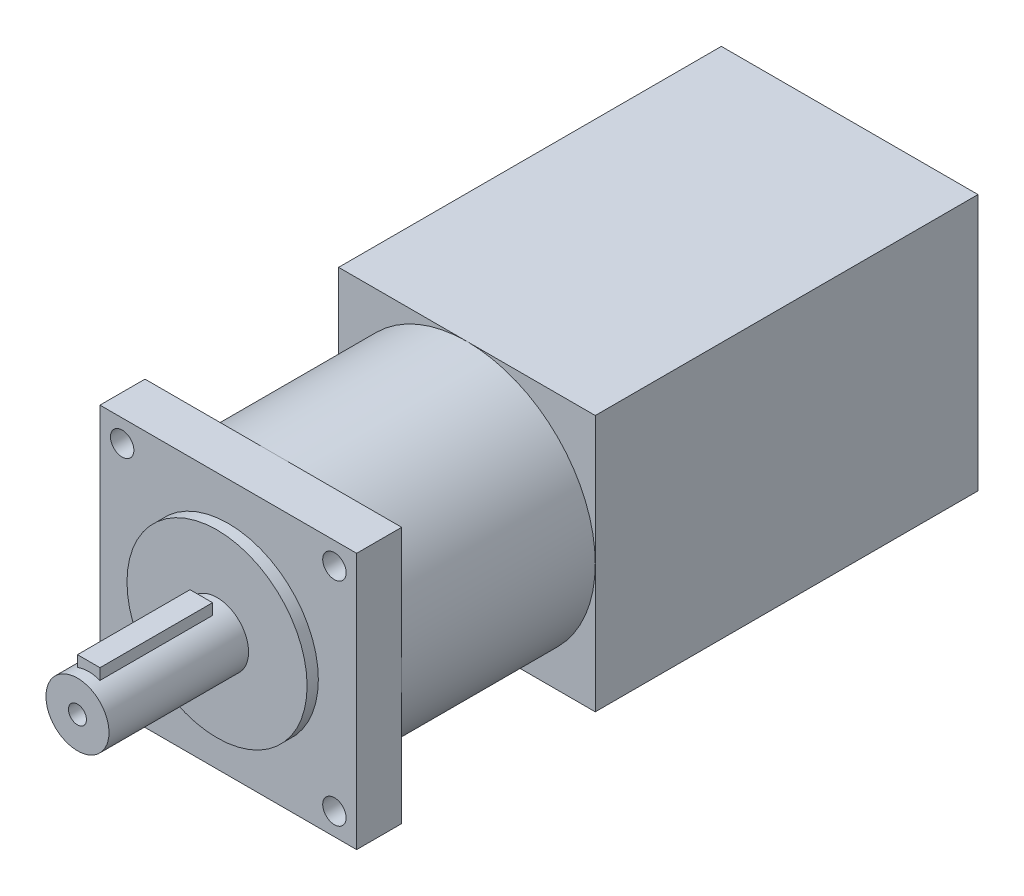
ISO-10303-21;
HEADER;
FILE_DESCRIPTION(('STEP AP214'),'2;1');
FILE_NAME('part.step','',(''),(''),'','','');
FILE_SCHEMA(('AUTOMOTIVE_DESIGN { 1 0 10303 214 1 1 1 1 }'));
ENDSEC;
DATA;
#1=APPLICATION_CONTEXT('core data for automotive mechanical design processes');
#2=APPLICATION_PROTOCOL_DEFINITION('international standard','automotive_design',2000,#1);
#3=PRODUCT_CONTEXT('',#1,'mechanical');
#4=PRODUCT('Part','Part','',(#3));
#5=PRODUCT_RELATED_PRODUCT_CATEGORY('part','',(#4));
#6=PRODUCT_DEFINITION_FORMATION('','',#4);
#7=PRODUCT_DEFINITION_CONTEXT('part definition',#1,'design');
#8=PRODUCT_DEFINITION('design','',#6,#7);
#9=PRODUCT_DEFINITION_SHAPE('','',#8);
#10=(LENGTH_UNIT() NAMED_UNIT(*) SI_UNIT(.MILLI.,.METRE.));
#11=(NAMED_UNIT(*) PLANE_ANGLE_UNIT() SI_UNIT($,.RADIAN.));
#12=(NAMED_UNIT(*) SI_UNIT($,.STERADIAN.) SOLID_ANGLE_UNIT());
#13=UNCERTAINTY_MEASURE_WITH_UNIT(LENGTH_MEASURE(1.E-05),#10,'distance_accuracy_value','');
#14=(GEOMETRIC_REPRESENTATION_CONTEXT(3) GLOBAL_UNCERTAINTY_ASSIGNED_CONTEXT((#13)) GLOBAL_UNIT_ASSIGNED_CONTEXT((#10,
#11,#12)) REPRESENTATION_CONTEXT('',''));
#15=CARTESIAN_POINT('',(0.,0.,0.));
#16=DIRECTION('',(0.,0.,1.));
#17=DIRECTION('',(1.,0.,0.));
#18=AXIS2_PLACEMENT_3D('',#15,#16,#17);
#19=CARTESIAN_POINT('',(0.,0.,171.5));
#20=DIRECTION('',(0.,0.,-1.));
#21=DIRECTION('',(-1.,0.,0.));
#22=AXIS2_PLACEMENT_3D('',#19,#20,#21);
#23=CYLINDRICAL_SURFACE('',#22,7.);
#24=CARTESIAN_POINT('',(0.,0.,140.5));
#25=DIRECTION('',(0.,0.,1.));
#26=DIRECTION('',(1.,0.,0.));
#27=AXIS2_PLACEMENT_3D('',#24,#25,#26);
#28=CIRCLE('',#27,7.);
#29=CARTESIAN_POINT('',(7.,0.,140.5));
#30=VERTEX_POINT('',#29);
#31=EDGE_CURVE('E247',#30,#30,#28,.T.);
#32=ORIENTED_EDGE('',*,*,#31,.T.);
#33=EDGE_LOOP('',(#32));
#34=FACE_BOUND('',#33,.T.);
#35=CARTESIAN_POINT('',(0.,0.,171.5));
#36=DIRECTION('',(0.,0.,1.));
#37=DIRECTION('',(1.,0.,0.));
#38=AXIS2_PLACEMENT_3D('',#35,#36,#37);
#39=CIRCLE('',#38,7.);
#40=CARTESIAN_POINT('',(7.,0.,171.5));
#41=VERTEX_POINT('',#40);
#42=EDGE_CURVE('E235',#41,#41,#39,.T.);
#43=ORIENTED_EDGE('',*,*,#42,.F.);
#44=EDGE_LOOP('',(#43));
#45=FACE_BOUND('',#44,.T.);
#46=CARTESIAN_POINT('',(0.,0.,144.));
#47=DIRECTION('',(0.,0.,1.));
#48=DIRECTION('',(1.,0.,0.));
#49=AXIS2_PLACEMENT_3D('',#46,#47,#48);
#50=CIRCLE('',#49,7.);
#51=CARTESIAN_POINT('',(2.5,6.53834841531101,144.));
#52=VERTEX_POINT('',#51);
#53=CARTESIAN_POINT('',(-2.5,6.53834841531101,144.));
#54=VERTEX_POINT('',#53);
#55=EDGE_CURVE('E11',#52,#54,#50,.T.);
#56=ORIENTED_EDGE('',*,*,#55,.F.);
#57=DIRECTION('',(0.,0.,-1.));
#58=VECTOR('',#57,1.);
#59=CARTESIAN_POINT('',(2.5,6.53834841531101,171.5));
#60=LINE('',#59,#58);
#61=CARTESIAN_POINT('',(2.5,6.53834841531101,169.));
#62=VERTEX_POINT('',#61);
#63=EDGE_CURVE('E157',#52,#62,#60,.F.);
#64=ORIENTED_EDGE('',*,*,#63,.T.);
#65=CARTESIAN_POINT('',(0.,0.,169.));
#66=DIRECTION('',(0.,0.,1.));
#67=DIRECTION('',(1.,0.,0.));
#68=AXIS2_PLACEMENT_3D('',#65,#66,#67);
#69=CIRCLE('',#68,7.);
#70=CARTESIAN_POINT('',(-2.5,6.53834841531101,169.));
#71=VERTEX_POINT('',#70);
#72=EDGE_CURVE('E301',#62,#71,#69,.T.);
#73=ORIENTED_EDGE('',*,*,#72,.T.);
#74=DIRECTION('',(0.,0.,-1.));
#75=VECTOR('',#74,1.);
#76=CARTESIAN_POINT('',(-2.5,6.53834841531101,171.5));
#77=LINE('',#76,#75);
#78=EDGE_CURVE('E44',#71,#54,#77,.T.);
#79=ORIENTED_EDGE('',*,*,#78,.T.);
#80=EDGE_LOOP('',(#56,#64,#73,#79));
#81=FACE_BOUND('',#80,.T.);
#82=ADVANCED_FACE('F36',(#34,#45,#81),#23,.T.);
#83=CARTESIAN_POINT('',(0.,0.,138.));
#84=DIRECTION('',(0.,0.,1.));
#85=DIRECTION('',(1.,0.,0.));
#86=AXIS2_PLACEMENT_3D('',#83,#84,#85);
#87=PLANE('',#86);
#88=CARTESIAN_POINT('',(0.,0.,138.));
#89=DIRECTION('',(0.,0.,1.));
#90=DIRECTION('',(1.,0.,0.));
#91=AXIS2_PLACEMENT_3D('',#88,#89,#90);
#92=CIRCLE('',#91,20.);
#93=CARTESIAN_POINT('',(20.,0.,138.));
#94=VERTEX_POINT('',#93);
#95=EDGE_CURVE('E251',#94,#94,#92,.T.);
#96=ORIENTED_EDGE('',*,*,#95,.F.);
#97=EDGE_LOOP('',(#96));
#98=FACE_BOUND('',#97,.T.);
#99=DIRECTION('',(1.,0.,0.));
#100=VECTOR('',#99,1.);
#101=CARTESIAN_POINT('',(-28.5,-28.5,138.));
#102=LINE('',#101,#100);
#103=CARTESIAN_POINT('',(-28.5,-28.5,138.));
#104=VERTEX_POINT('',#103);
#105=CARTESIAN_POINT('',(28.5,-28.5,138.));
#106=VERTEX_POINT('',#105);
#107=EDGE_CURVE('E229',#104,#106,#102,.T.);
#108=ORIENTED_EDGE('',*,*,#107,.T.);
#109=DIRECTION('',(0.,1.,0.));
#110=VECTOR('',#109,1.);
#111=CARTESIAN_POINT('',(28.5,-28.5,138.));
#112=LINE('',#111,#110);
#113=CARTESIAN_POINT('',(28.5,28.5,138.));
#114=VERTEX_POINT('',#113);
#115=EDGE_CURVE('E204',#106,#114,#112,.T.);
#116=ORIENTED_EDGE('',*,*,#115,.T.);
#117=DIRECTION('',(-1.,0.,0.));
#118=VECTOR('',#117,1.);
#119=CARTESIAN_POINT('',(-28.5,28.5,138.));
#120=LINE('',#119,#118);
#121=CARTESIAN_POINT('',(-28.5,28.5,138.));
#122=VERTEX_POINT('',#121);
#123=EDGE_CURVE('E224',#114,#122,#120,.T.);
#124=ORIENTED_EDGE('',*,*,#123,.T.);
#125=DIRECTION('',(0.,-1.,0.));
#126=VECTOR('',#125,1.);
#127=CARTESIAN_POINT('',(-28.5,-28.5,138.));
#128=LINE('',#127,#126);
#129=EDGE_CURVE('E226',#122,#104,#128,.T.);
#130=ORIENTED_EDGE('',*,*,#129,.T.);
#131=EDGE_LOOP('',(#108,#116,#124,#130));
#132=FACE_BOUND('',#131,.T.);
#133=CARTESIAN_POINT('',(-23.5699999999987,-23.57,138.));
#134=DIRECTION('',(0.,0.,1.));
#135=DIRECTION('',(1.,0.,0.));
#136=AXIS2_PLACEMENT_3D('',#133,#134,#135);
#137=CIRCLE('',#136,2.60000000000069);
#138=CARTESIAN_POINT('',(-20.969999999998,-23.57,138.));
#139=VERTEX_POINT('',#138);
#140=EDGE_CURVE('E181',#139,#139,#137,.T.);
#141=ORIENTED_EDGE('',*,*,#140,.F.);
#142=EDGE_LOOP('',(#141));
#143=FACE_BOUND('',#142,.T.);
#144=CARTESIAN_POINT('',(23.5700000000013,-23.5699999999987,138.));
#145=DIRECTION('',(0.,0.,1.));
#146=DIRECTION('',(1.,0.,0.));
#147=AXIS2_PLACEMENT_3D('',#144,#145,#146);
#148=CIRCLE('',#147,2.60000000000186);
#149=CARTESIAN_POINT('',(26.1700000000032,-23.5699999999987,138.));
#150=VERTEX_POINT('',#149);
#151=EDGE_CURVE('E186',#150,#150,#148,.T.);
#152=ORIENTED_EDGE('',*,*,#151,.F.);
#153=EDGE_LOOP('',(#152));
#154=FACE_BOUND('',#153,.T.);
#155=CARTESIAN_POINT('',(23.57,23.5700000000013,138.));
#156=DIRECTION('',(0.,0.,1.));
#157=DIRECTION('',(1.,0.,0.));
#158=AXIS2_PLACEMENT_3D('',#155,#156,#157);
#159=CIRCLE('',#158,2.60000000000137);
#160=CARTESIAN_POINT('',(26.1700000000014,23.5700000000013,138.));
#161=VERTEX_POINT('',#160);
#162=EDGE_CURVE('E192',#161,#161,#159,.T.);
#163=ORIENTED_EDGE('',*,*,#162,.F.);
#164=EDGE_LOOP('',(#163));
#165=FACE_BOUND('',#164,.T.);
#166=CARTESIAN_POINT('',(-23.57,23.57,138.));
#167=DIRECTION('',(0.,0.,1.));
#168=DIRECTION('',(1.,0.,0.));
#169=AXIS2_PLACEMENT_3D('',#166,#167,#168);
#170=CIRCLE('',#169,2.6);
#171=CARTESIAN_POINT('',(-20.97,23.57,138.));
#172=VERTEX_POINT('',#171);
#173=EDGE_CURVE('E198',#172,#172,#170,.T.);
#174=ORIENTED_EDGE('',*,*,#173,.F.);
#175=EDGE_LOOP('',(#174));
#176=FACE_BOUND('',#175,.T.);
#177=ADVANCED_FACE('F333',(#98,#132,#143,#154,#165,#176),#87,.T.);
#178=CARTESIAN_POINT('',(0.,0.,140.5));
#179=DIRECTION('',(0.,0.,-1.));
#180=DIRECTION('',(-1.,0.,0.));
#181=AXIS2_PLACEMENT_3D('',#178,#179,#180);
#182=CYLINDRICAL_SURFACE('',#181,20.);
#183=CARTESIAN_POINT('',(0.,0.,140.5));
#184=DIRECTION('',(0.,0.,1.));
#185=DIRECTION('',(1.,0.,0.));
#186=AXIS2_PLACEMENT_3D('',#183,#184,#185);
#187=CIRCLE('',#186,20.);
#188=CARTESIAN_POINT('',(20.,0.,140.5));
#189=VERTEX_POINT('',#188);
#190=EDGE_CURVE('E246',#189,#189,#187,.T.);
#191=ORIENTED_EDGE('',*,*,#190,.F.);
#192=EDGE_LOOP('',(#191));
#193=FACE_BOUND('',#192,.T.);
#194=ORIENTED_EDGE('',*,*,#95,.T.);
#195=EDGE_LOOP('',(#194));
#196=FACE_BOUND('',#195,.T.);
#197=ADVANCED_FACE('F339',(#193,#196),#182,.T.);
#198=CARTESIAN_POINT('',(0.,0.,140.5));
#199=DIRECTION('',(0.,0.,1.));
#200=DIRECTION('',(1.,0.,0.));
#201=AXIS2_PLACEMENT_3D('',#198,#199,#200);
#202=PLANE('',#201);
#203=ORIENTED_EDGE('',*,*,#31,.F.);
#204=EDGE_LOOP('',(#203));
#205=FACE_BOUND('',#204,.T.);
#206=ORIENTED_EDGE('',*,*,#190,.T.);
#207=EDGE_LOOP('',(#206));
#208=FACE_BOUND('',#207,.T.);
#209=ADVANCED_FACE('F328',(#205,#208),#202,.T.);
#210=CARTESIAN_POINT('',(0.,0.,171.5));
#211=DIRECTION('',(0.,0.,1.));
#212=DIRECTION('',(1.,0.,0.));
#213=AXIS2_PLACEMENT_3D('',#210,#211,#212);
#214=PLANE('',#213);
#215=CARTESIAN_POINT('',(0.,0.,171.5));
#216=DIRECTION('',(0.,0.,1.));
#217=DIRECTION('',(1.,0.,0.));
#218=AXIS2_PLACEMENT_3D('',#215,#216,#217);
#219=CIRCLE('',#218,2.);
#220=CARTESIAN_POINT('',(2.,0.,171.5));
#221=VERTEX_POINT('',#220);
#222=EDGE_CURVE('E309',#221,#221,#219,.T.);
#223=ORIENTED_EDGE('',*,*,#222,.F.);
#224=EDGE_LOOP('',(#223));
#225=FACE_BOUND('',#224,.T.);
#226=ORIENTED_EDGE('',*,*,#42,.T.);
#227=EDGE_LOOP('',(#226));
#228=FACE_BOUND('',#227,.T.);
#229=ADVANCED_FACE('F324',(#225,#228),#214,.T.);
#230=CARTESIAN_POINT('',(0.,0.,128.));
#231=DIRECTION('',(0.,0.,-1.));
#232=DIRECTION('',(-1.,0.,0.));
#233=AXIS2_PLACEMENT_3D('',#230,#231,#232);
#234=PLANE('',#233);
#235=CARTESIAN_POINT('',(0.,0.,128.));
#236=DIRECTION('',(0.,0.,-1.));
#237=DIRECTION('',(-1.,0.,0.));
#238=AXIS2_PLACEMENT_3D('',#235,#236,#237);
#239=CIRCLE('',#238,28.5);
#240=CARTESIAN_POINT('',(-28.5,0.,128.));
#241=VERTEX_POINT('',#240);
#242=CARTESIAN_POINT('',(0.,28.5,128.));
#243=VERTEX_POINT('',#242);
#244=EDGE_CURVE('E300',#241,#243,#239,.T.);
#245=ORIENTED_EDGE('',*,*,#244,.F.);
#246=DIRECTION('',(0.,-1.,0.));
#247=VECTOR('',#246,1.);
#248=CARTESIAN_POINT('',(-28.5,-28.5,128.));
#249=LINE('',#248,#247);
#250=CARTESIAN_POINT('',(-28.5,28.5,128.));
#251=VERTEX_POINT('',#250);
#252=EDGE_CURVE('E59',#251,#241,#249,.T.);
#253=ORIENTED_EDGE('',*,*,#252,.F.);
#254=DIRECTION('',(-1.,0.,0.));
#255=VECTOR('',#254,1.);
#256=CARTESIAN_POINT('',(-28.5,28.5,128.));
#257=LINE('',#256,#255);
#258=EDGE_CURVE('E210',#243,#251,#257,.T.);
#259=ORIENTED_EDGE('',*,*,#258,.F.);
#260=EDGE_LOOP('',(#245,#253,#259));
#261=FACE_BOUND('',#260,.T.);
#262=CARTESIAN_POINT('',(-23.57,23.57,128.));
#263=DIRECTION('',(0.,0.,1.));
#264=DIRECTION('',(1.,0.,0.));
#265=AXIS2_PLACEMENT_3D('',#262,#263,#264);
#266=CIRCLE('',#265,2.6);
#267=CARTESIAN_POINT('',(-20.97,23.57,128.));
#268=VERTEX_POINT('',#267);
#269=EDGE_CURVE('E201',#268,#268,#266,.T.);
#270=ORIENTED_EDGE('',*,*,#269,.T.);
#271=EDGE_LOOP('',(#270));
#272=FACE_BOUND('',#271,.T.);
#273=ADVANCED_FACE('F327',(#261,#272),#234,.T.);
#274=CARTESIAN_POINT('',(28.5,0.,128.));
#275=VERTEX_POINT('',#274);
#276=EDGE_CURVE('E672',#243,#275,#239,.T.);
#277=ORIENTED_EDGE('',*,*,#276,.F.);
#278=CARTESIAN_POINT('',(28.5,28.5,128.));
#279=VERTEX_POINT('',#278);
#280=EDGE_CURVE('E212',#279,#243,#257,.T.);
#281=ORIENTED_EDGE('',*,*,#280,.F.);
#282=DIRECTION('',(0.,1.,0.));
#283=VECTOR('',#282,1.);
#284=CARTESIAN_POINT('',(28.5,-28.5,128.));
#285=LINE('',#284,#283);
#286=EDGE_CURVE('E211',#275,#279,#285,.T.);
#287=ORIENTED_EDGE('',*,*,#286,.F.);
#288=EDGE_LOOP('',(#277,#281,#287));
#289=FACE_BOUND('',#288,.T.);
#290=CARTESIAN_POINT('',(23.57,23.5700000000013,128.));
#291=DIRECTION('',(0.,0.,1.));
#292=DIRECTION('',(1.,0.,0.));
#293=AXIS2_PLACEMENT_3D('',#290,#291,#292);
#294=CIRCLE('',#293,2.60000000000137);
#295=CARTESIAN_POINT('',(26.1700000000014,23.5700000000013,128.));
#296=VERTEX_POINT('',#295);
#297=EDGE_CURVE('E195',#296,#296,#294,.T.);
#298=ORIENTED_EDGE('',*,*,#297,.T.);
#299=EDGE_LOOP('',(#298));
#300=FACE_BOUND('',#299,.T.);
#301=ADVANCED_FACE('F521',(#289,#300),#234,.T.);
#302=CARTESIAN_POINT('',(0.,-28.5,128.));
#303=VERTEX_POINT('',#302);
#304=EDGE_CURVE('E299',#275,#303,#239,.T.);
#305=ORIENTED_EDGE('',*,*,#304,.F.);
#306=CARTESIAN_POINT('',(28.5,-28.5,128.));
#307=VERTEX_POINT('',#306);
#308=EDGE_CURVE('E207',#307,#275,#285,.T.);
#309=ORIENTED_EDGE('',*,*,#308,.F.);
#310=DIRECTION('',(1.,0.,0.));
#311=VECTOR('',#310,1.);
#312=CARTESIAN_POINT('',(-28.5,-28.5,128.));
#313=LINE('',#312,#311);
#314=EDGE_CURVE('E217',#303,#307,#313,.T.);
#315=ORIENTED_EDGE('',*,*,#314,.F.);
#316=EDGE_LOOP('',(#305,#309,#315));
#317=FACE_BOUND('',#316,.T.);
#318=CARTESIAN_POINT('',(23.5700000000013,-23.5699999999987,128.));
#319=DIRECTION('',(0.,0.,1.));
#320=DIRECTION('',(1.,0.,0.));
#321=AXIS2_PLACEMENT_3D('',#318,#319,#320);
#322=CIRCLE('',#321,2.60000000000186);
#323=CARTESIAN_POINT('',(26.1700000000032,-23.5699999999987,128.));
#324=VERTEX_POINT('',#323);
#325=EDGE_CURVE('E189',#324,#324,#322,.T.);
#326=ORIENTED_EDGE('',*,*,#325,.T.);
#327=EDGE_LOOP('',(#326));
#328=FACE_BOUND('',#327,.T.);
#329=ADVANCED_FACE('F486',(#317,#328),#234,.T.);
#330=CARTESIAN_POINT('',(28.5,-28.5,128.));
#331=DIRECTION('',(1.,0.,0.));
#332=DIRECTION('',(0.,0.,-1.));
#333=AXIS2_PLACEMENT_3D('',#330,#331,#332);
#334=PLANE('',#333);
#335=ORIENTED_EDGE('',*,*,#308,.T.);
#336=ORIENTED_EDGE('',*,*,#286,.T.);
#337=DIRECTION('',(0.,0.,1.));
#338=VECTOR('',#337,1.);
#339=CARTESIAN_POINT('',(28.5,28.5,128.));
#340=LINE('',#339,#338);
#341=EDGE_CURVE('E221',#279,#114,#340,.T.);
#342=ORIENTED_EDGE('',*,*,#341,.T.);
#343=ORIENTED_EDGE('',*,*,#115,.F.);
#344=DIRECTION('',(0.,0.,1.));
#345=VECTOR('',#344,1.);
#346=CARTESIAN_POINT('',(28.5,-28.5,128.));
#347=LINE('',#346,#345);
#348=EDGE_CURVE('E232',#307,#106,#347,.T.);
#349=ORIENTED_EDGE('',*,*,#348,.F.);
#350=EDGE_LOOP('',(#335,#336,#342,#343,#349));
#351=FACE_BOUND('',#350,.T.);
#352=ADVANCED_FACE('F507',(#351),#334,.T.);
#353=CARTESIAN_POINT('',(-28.5,-28.5,128.));
#354=DIRECTION('',(0.,-1.,0.));
#355=DIRECTION('',(0.,0.,-1.));
#356=AXIS2_PLACEMENT_3D('',#353,#354,#355);
#357=PLANE('',#356);
#358=CARTESIAN_POINT('',(-28.5,-28.5,128.));
#359=VERTEX_POINT('',#358);
#360=EDGE_CURVE('E218',#359,#303,#313,.T.);
#361=ORIENTED_EDGE('',*,*,#360,.T.);
#362=ORIENTED_EDGE('',*,*,#314,.T.);
#363=ORIENTED_EDGE('',*,*,#348,.T.);
#364=ORIENTED_EDGE('',*,*,#107,.F.);
#365=DIRECTION('',(0.,0.,1.));
#366=VECTOR('',#365,1.);
#367=CARTESIAN_POINT('',(-28.5,-28.5,128.));
#368=LINE('',#367,#366);
#369=EDGE_CURVE('E236',#359,#104,#368,.T.);
#370=ORIENTED_EDGE('',*,*,#369,.F.);
#371=EDGE_LOOP('',(#361,#362,#363,#364,#370));
#372=FACE_BOUND('',#371,.T.);
#373=ADVANCED_FACE('F500',(#372),#357,.T.);
#374=CARTESIAN_POINT('',(-28.5,-28.5,128.));
#375=DIRECTION('',(-1.,0.,0.));
#376=DIRECTION('',(0.,0.,1.));
#377=AXIS2_PLACEMENT_3D('',#374,#375,#376);
#378=PLANE('',#377);
#379=ORIENTED_EDGE('',*,*,#252,.T.);
#380=EDGE_CURVE('E215',#241,#359,#249,.T.);
#381=ORIENTED_EDGE('',*,*,#380,.T.);
#382=ORIENTED_EDGE('',*,*,#369,.T.);
#383=ORIENTED_EDGE('',*,*,#129,.F.);
#384=DIRECTION('',(0.,0.,1.));
#385=VECTOR('',#384,1.);
#386=CARTESIAN_POINT('',(-28.5,28.5,128.));
#387=LINE('',#386,#385);
#388=EDGE_CURVE('E239',#251,#122,#387,.T.);
#389=ORIENTED_EDGE('',*,*,#388,.F.);
#390=EDGE_LOOP('',(#379,#381,#382,#383,#389));
#391=FACE_BOUND('',#390,.T.);
#392=ADVANCED_FACE('F492',(#391),#378,.T.);
#393=CARTESIAN_POINT('',(-28.5,28.5,128.));
#394=DIRECTION('',(0.,1.,0.));
#395=DIRECTION('',(0.,0.,1.));
#396=AXIS2_PLACEMENT_3D('',#393,#394,#395);
#397=PLANE('',#396);
#398=ORIENTED_EDGE('',*,*,#280,.T.);
#399=ORIENTED_EDGE('',*,*,#258,.T.);
#400=ORIENTED_EDGE('',*,*,#388,.T.);
#401=ORIENTED_EDGE('',*,*,#123,.F.);
#402=ORIENTED_EDGE('',*,*,#341,.F.);
#403=EDGE_LOOP('',(#398,#399,#400,#401,#402));
#404=FACE_BOUND('',#403,.T.);
#405=ADVANCED_FACE('F483',(#404),#397,.T.);
#406=EDGE_CURVE('E250',#303,#241,#239,.T.);
#407=ORIENTED_EDGE('',*,*,#406,.F.);
#408=ORIENTED_EDGE('',*,*,#360,.F.);
#409=ORIENTED_EDGE('',*,*,#380,.F.);
#410=EDGE_LOOP('',(#407,#408,#409));
#411=FACE_BOUND('',#410,.T.);
#412=CARTESIAN_POINT('',(-23.5699999999987,-23.57,128.));
#413=DIRECTION('',(0.,0.,1.));
#414=DIRECTION('',(1.,0.,0.));
#415=AXIS2_PLACEMENT_3D('',#412,#413,#414);
#416=CIRCLE('',#415,2.60000000000069);
#417=CARTESIAN_POINT('',(-20.969999999998,-23.57,128.));
#418=VERTEX_POINT('',#417);
#419=EDGE_CURVE('E183',#418,#418,#416,.T.);
#420=ORIENTED_EDGE('',*,*,#419,.T.);
#421=EDGE_LOOP('',(#420));
#422=FACE_BOUND('',#421,.T.);
#423=ADVANCED_FACE('F475',(#411,#422),#234,.T.);
#424=CARTESIAN_POINT('',(-23.57,23.57,128.));
#425=DIRECTION('',(0.,0.,1.));
#426=DIRECTION('',(1.,0.,0.));
#427=AXIS2_PLACEMENT_3D('',#424,#425,#426);
#428=CYLINDRICAL_SURFACE('',#427,2.6);
#429=ORIENTED_EDGE('',*,*,#269,.F.);
#430=EDGE_LOOP('',(#429));
#431=FACE_BOUND('',#430,.T.);
#432=ORIENTED_EDGE('',*,*,#173,.T.);
#433=EDGE_LOOP('',(#432));
#434=FACE_BOUND('',#433,.T.);
#435=ADVANCED_FACE('F467',(#431,#434),#428,.F.);
#436=CARTESIAN_POINT('',(23.57,23.5700000000013,128.));
#437=DIRECTION('',(0.,0.,1.));
#438=DIRECTION('',(1.,0.,0.));
#439=AXIS2_PLACEMENT_3D('',#436,#437,#438);
#440=CYLINDRICAL_SURFACE('',#439,2.60000000000137);
#441=ORIENTED_EDGE('',*,*,#297,.F.);
#442=EDGE_LOOP('',(#441));
#443=FACE_BOUND('',#442,.T.);
#444=ORIENTED_EDGE('',*,*,#162,.T.);
#445=EDGE_LOOP('',(#444));
#446=FACE_BOUND('',#445,.T.);
#447=ADVANCED_FACE('F459',(#443,#446),#440,.F.);
#448=CARTESIAN_POINT('',(23.5700000000013,-23.5699999999987,128.));
#449=DIRECTION('',(0.,0.,1.));
#450=DIRECTION('',(1.,0.,0.));
#451=AXIS2_PLACEMENT_3D('',#448,#449,#450);
#452=CYLINDRICAL_SURFACE('',#451,2.60000000000186);
#453=ORIENTED_EDGE('',*,*,#325,.F.);
#454=EDGE_LOOP('',(#453));
#455=FACE_BOUND('',#454,.T.);
#456=ORIENTED_EDGE('',*,*,#151,.T.);
#457=EDGE_LOOP('',(#456));
#458=FACE_BOUND('',#457,.T.);
#459=ADVANCED_FACE('F450',(#455,#458),#452,.F.);
#460=CARTESIAN_POINT('',(-23.5699999999987,-23.57,128.));
#461=DIRECTION('',(0.,0.,1.));
#462=DIRECTION('',(1.,0.,0.));
#463=AXIS2_PLACEMENT_3D('',#460,#461,#462);
#464=CYLINDRICAL_SURFACE('',#463,2.60000000000069);
#465=ORIENTED_EDGE('',*,*,#419,.F.);
#466=EDGE_LOOP('',(#465));
#467=FACE_BOUND('',#466,.T.);
#468=ORIENTED_EDGE('',*,*,#140,.T.);
#469=EDGE_LOOP('',(#468));
#470=FACE_BOUND('',#469,.T.);
#471=ADVANCED_FACE('F364',(#467,#470),#464,.F.);
#472=CARTESIAN_POINT('',(0.,0.,0.));
#473=DIRECTION('',(0.,0.,1.));
#474=DIRECTION('',(1.,0.,0.));
#475=AXIS2_PLACEMENT_3D('',#472,#473,#474);
#476=PLANE('',#475);
#477=DIRECTION('',(0.,1.,0.));
#478=VECTOR('',#477,1.);
#479=CARTESIAN_POINT('',(28.5,28.5,0.));
#480=LINE('',#479,#478);
#481=CARTESIAN_POINT('',(28.5,-28.5,0.));
#482=VERTEX_POINT('',#481);
#483=CARTESIAN_POINT('',(28.5,28.5,0.));
#484=VERTEX_POINT('',#483);
#485=EDGE_CURVE('E260',#482,#484,#480,.T.);
#486=ORIENTED_EDGE('',*,*,#485,.F.);
#487=DIRECTION('',(1.,0.,0.));
#488=VECTOR('',#487,1.);
#489=CARTESIAN_POINT('',(-28.5,-28.5,0.));
#490=LINE('',#489,#488);
#491=CARTESIAN_POINT('',(-28.5,-28.5,0.));
#492=VERTEX_POINT('',#491);
#493=EDGE_CURVE('E284',#492,#482,#490,.T.);
#494=ORIENTED_EDGE('',*,*,#493,.F.);
#495=DIRECTION('',(0.,-1.,0.));
#496=VECTOR('',#495,1.);
#497=CARTESIAN_POINT('',(-28.5,28.5,0.));
#498=LINE('',#497,#496);
#499=CARTESIAN_POINT('',(-28.5,28.5,0.));
#500=VERTEX_POINT('',#499);
#501=EDGE_CURVE('E282',#500,#492,#498,.T.);
#502=ORIENTED_EDGE('',*,*,#501,.F.);
#503=DIRECTION('',(-1.,0.,0.));
#504=VECTOR('',#503,1.);
#505=CARTESIAN_POINT('',(-28.5,28.5,0.));
#506=LINE('',#505,#504);
#507=EDGE_CURVE('E280',#484,#500,#506,.T.);
#508=ORIENTED_EDGE('',*,*,#507,.F.);
#509=EDGE_LOOP('',(#486,#494,#502,#508));
#510=FACE_BOUND('',#509,.T.);
#511=ADVANCED_FACE('F360',(#510),#476,.F.);
#512=CARTESIAN_POINT('',(-28.5,-28.5,85.));
#513=DIRECTION('',(0.,1.,0.));
#514=DIRECTION('',(0.,0.,1.));
#515=AXIS2_PLACEMENT_3D('',#512,#513,#514);
#516=PLANE('',#515);
#517=ORIENTED_EDGE('',*,*,#493,.T.);
#518=DIRECTION('',(0.,0.,-1.));
#519=VECTOR('',#518,1.);
#520=CARTESIAN_POINT('',(28.5,-28.5,85.));
#521=LINE('',#520,#519);
#522=CARTESIAN_POINT('',(28.5,-28.5,85.));
#523=VERTEX_POINT('',#522);
#524=EDGE_CURVE('E277',#523,#482,#521,.T.);
#525=ORIENTED_EDGE('',*,*,#524,.F.);
#526=DIRECTION('',(1.,0.,0.));
#527=VECTOR('',#526,1.);
#528=CARTESIAN_POINT('',(-28.5,-28.5,85.));
#529=LINE('',#528,#527);
#530=CARTESIAN_POINT('',(0.,-28.5,85.));
#531=VERTEX_POINT('',#530);
#532=EDGE_CURVE('E273',#531,#523,#529,.T.);
#533=ORIENTED_EDGE('',*,*,#532,.F.);
#534=CARTESIAN_POINT('',(-28.5,-28.5,85.));
#535=VERTEX_POINT('',#534);
#536=EDGE_CURVE('E274',#535,#531,#529,.T.);
#537=ORIENTED_EDGE('',*,*,#536,.F.);
#538=DIRECTION('',(0.,0.,-1.));
#539=VECTOR('',#538,1.);
#540=CARTESIAN_POINT('',(-28.5,-28.5,85.));
#541=LINE('',#540,#539);
#542=EDGE_CURVE('E288',#535,#492,#541,.T.);
#543=ORIENTED_EDGE('',*,*,#542,.T.);
#544=EDGE_LOOP('',(#517,#525,#533,#537,#543));
#545=FACE_BOUND('',#544,.T.);
#546=ADVANCED_FACE('F363',(#545),#516,.F.);
#547=CARTESIAN_POINT('',(-28.5,28.5,85.));
#548=DIRECTION('',(1.,0.,0.));
#549=DIRECTION('',(0.,1.,0.));
#550=AXIS2_PLACEMENT_3D('',#547,#548,#549);
#551=PLANE('',#550);
#552=ORIENTED_EDGE('',*,*,#501,.T.);
#553=ORIENTED_EDGE('',*,*,#542,.F.);
#554=DIRECTION('',(0.,-1.,0.));
#555=VECTOR('',#554,1.);
#556=CARTESIAN_POINT('',(-28.5,28.5,85.));
#557=LINE('',#556,#555);
#558=CARTESIAN_POINT('',(-28.5,0.,85.));
#559=VERTEX_POINT('',#558);
#560=EDGE_CURVE('E269',#559,#535,#557,.T.);
#561=ORIENTED_EDGE('',*,*,#560,.F.);
#562=CARTESIAN_POINT('',(-28.5,28.5,85.));
#563=VERTEX_POINT('',#562);
#564=EDGE_CURVE('E270',#563,#559,#557,.T.);
#565=ORIENTED_EDGE('',*,*,#564,.F.);
#566=DIRECTION('',(0.,0.,-1.));
#567=VECTOR('',#566,1.);
#568=CARTESIAN_POINT('',(-28.5,28.5,85.));
#569=LINE('',#568,#567);
#570=EDGE_CURVE('E291',#563,#500,#569,.T.);
#571=ORIENTED_EDGE('',*,*,#570,.T.);
#572=EDGE_LOOP('',(#552,#553,#561,#565,#571));
#573=FACE_BOUND('',#572,.T.);
#574=ADVANCED_FACE('F368',(#573),#551,.F.);
#575=CARTESIAN_POINT('',(-28.5,28.5,85.));
#576=DIRECTION('',(0.,-1.,0.));
#577=DIRECTION('',(0.,0.,-1.));
#578=AXIS2_PLACEMENT_3D('',#575,#576,#577);
#579=PLANE('',#578);
#580=ORIENTED_EDGE('',*,*,#507,.T.);
#581=ORIENTED_EDGE('',*,*,#570,.F.);
#582=DIRECTION('',(-1.,0.,0.));
#583=VECTOR('',#582,1.);
#584=CARTESIAN_POINT('',(-28.5,28.5,85.));
#585=LINE('',#584,#583);
#586=CARTESIAN_POINT('',(0.,28.5,85.));
#587=VERTEX_POINT('',#586);
#588=EDGE_CURVE('E264',#587,#563,#585,.T.);
#589=ORIENTED_EDGE('',*,*,#588,.F.);
#590=CARTESIAN_POINT('',(28.5,28.5,85.));
#591=VERTEX_POINT('',#590);
#592=EDGE_CURVE('E266',#591,#587,#585,.T.);
#593=ORIENTED_EDGE('',*,*,#592,.F.);
#594=DIRECTION('',(0.,0.,-1.));
#595=VECTOR('',#594,1.);
#596=CARTESIAN_POINT('',(28.5,28.5,85.));
#597=LINE('',#596,#595);
#598=EDGE_CURVE('E294',#591,#484,#597,.T.);
#599=ORIENTED_EDGE('',*,*,#598,.T.);
#600=EDGE_LOOP('',(#580,#581,#589,#593,#599));
#601=FACE_BOUND('',#600,.T.);
#602=ADVANCED_FACE('F371',(#601),#579,.F.);
#603=CARTESIAN_POINT('',(28.5,28.5,85.));
#604=DIRECTION('',(-1.,0.,0.));
#605=DIRECTION('',(0.,-1.,0.));
#606=AXIS2_PLACEMENT_3D('',#603,#604,#605);
#607=PLANE('',#606);
#608=ORIENTED_EDGE('',*,*,#485,.T.);
#609=ORIENTED_EDGE('',*,*,#598,.F.);
#610=DIRECTION('',(0.,1.,0.));
#611=VECTOR('',#610,1.);
#612=CARTESIAN_POINT('',(28.5,28.5,85.));
#613=LINE('',#612,#611);
#614=CARTESIAN_POINT('',(28.5,0.,85.));
#615=VERTEX_POINT('',#614);
#616=EDGE_CURVE('E265',#615,#591,#613,.T.);
#617=ORIENTED_EDGE('',*,*,#616,.F.);
#618=EDGE_CURVE('E262',#523,#615,#613,.T.);
#619=ORIENTED_EDGE('',*,*,#618,.F.);
#620=ORIENTED_EDGE('',*,*,#524,.T.);
#621=EDGE_LOOP('',(#608,#609,#617,#619,#620));
#622=FACE_BOUND('',#621,.T.);
#623=ADVANCED_FACE('F38',(#622),#607,.F.);
#624=CARTESIAN_POINT('',(0.,0.,85.));
#625=DIRECTION('',(0.,0.,1.));
#626=DIRECTION('',(1.,0.,0.));
#627=AXIS2_PLACEMENT_3D('',#624,#625,#626);
#628=PLANE('',#627);
#629=CARTESIAN_POINT('',(0.,0.,85.));
#630=DIRECTION('',(0.,0.,1.));
#631=DIRECTION('',(1.,0.,0.));
#632=AXIS2_PLACEMENT_3D('',#629,#630,#631);
#633=CIRCLE('',#632,28.5);
#634=EDGE_CURVE('E261',#531,#615,#633,.T.);
#635=ORIENTED_EDGE('',*,*,#634,.F.);
#636=ORIENTED_EDGE('',*,*,#532,.T.);
#637=ORIENTED_EDGE('',*,*,#618,.T.);
#638=EDGE_LOOP('',(#635,#636,#637));
#639=FACE_BOUND('',#638,.T.);
#640=ADVANCED_FACE('F355',(#639),#628,.T.);
#641=EDGE_CURVE('E398',#559,#531,#633,.T.);
#642=ORIENTED_EDGE('',*,*,#641,.F.);
#643=ORIENTED_EDGE('',*,*,#560,.T.);
#644=ORIENTED_EDGE('',*,*,#536,.T.);
#645=EDGE_LOOP('',(#642,#643,#644));
#646=FACE_BOUND('',#645,.T.);
#647=ADVANCED_FACE('F358',(#646),#628,.T.);
#648=EDGE_CURVE('E257',#587,#559,#633,.T.);
#649=ORIENTED_EDGE('',*,*,#648,.F.);
#650=ORIENTED_EDGE('',*,*,#588,.T.);
#651=ORIENTED_EDGE('',*,*,#564,.T.);
#652=EDGE_LOOP('',(#649,#650,#651));
#653=FACE_BOUND('',#652,.T.);
#654=ADVANCED_FACE('F402',(#653),#628,.T.);
#655=EDGE_CURVE('E254',#615,#587,#633,.T.);
#656=ORIENTED_EDGE('',*,*,#655,.F.);
#657=ORIENTED_EDGE('',*,*,#616,.T.);
#658=ORIENTED_EDGE('',*,*,#592,.T.);
#659=EDGE_LOOP('',(#656,#657,#658));
#660=FACE_BOUND('',#659,.T.);
#661=ADVANCED_FACE('F353',(#660),#628,.T.);
#662=CARTESIAN_POINT('',(0.,0.,138.));
#663=DIRECTION('',(0.,0.,-1.));
#664=DIRECTION('',(-1.,0.,0.));
#665=AXIS2_PLACEMENT_3D('',#662,#663,#664);
#666=CYLINDRICAL_SURFACE('',#665,28.5);
#667=ORIENTED_EDGE('',*,*,#406,.T.);
#668=ORIENTED_EDGE('',*,*,#244,.T.);
#669=ORIENTED_EDGE('',*,*,#276,.T.);
#670=ORIENTED_EDGE('',*,*,#304,.T.);
#671=EDGE_LOOP('',(#667,#668,#669,#670));
#672=FACE_BOUND('',#671,.T.);
#673=ORIENTED_EDGE('',*,*,#655,.T.);
#674=ORIENTED_EDGE('',*,*,#648,.T.);
#675=ORIENTED_EDGE('',*,*,#641,.T.);
#676=ORIENTED_EDGE('',*,*,#634,.T.);
#677=EDGE_LOOP('',(#673,#674,#675,#676));
#678=FACE_BOUND('',#677,.T.);
#679=ADVANCED_FACE('F350',(#672,#678),#666,.T.);
#680=CARTESIAN_POINT('',(-2.5,5.,144.));
#681=DIRECTION('',(-1.,0.,0.));
#682=DIRECTION('',(0.,0.,1.));
#683=AXIS2_PLACEMENT_3D('',#680,#681,#682);
#684=PLANE('',#683);
#685=ORIENTED_EDGE('',*,*,#78,.F.);
#686=DIRECTION('',(0.,-1.,0.));
#687=VECTOR('',#686,1.);
#688=CARTESIAN_POINT('',(-2.5,5.,169.));
#689=LINE('',#688,#687);
#690=CARTESIAN_POINT('',(-2.5,9.,169.));
#691=VERTEX_POINT('',#690);
#692=EDGE_CURVE('E51',#691,#71,#689,.T.);
#693=ORIENTED_EDGE('',*,*,#692,.F.);
#694=DIRECTION('',(0.,0.,1.));
#695=VECTOR('',#694,1.);
#696=CARTESIAN_POINT('',(-2.5,9.,144.));
#697=LINE('',#696,#695);
#698=CARTESIAN_POINT('',(-2.5,9.,144.));
#699=VERTEX_POINT('',#698);
#700=EDGE_CURVE('E168',#699,#691,#697,.T.);
#701=ORIENTED_EDGE('',*,*,#700,.F.);
#702=DIRECTION('',(0.,-1.,0.));
#703=VECTOR('',#702,1.);
#704=CARTESIAN_POINT('',(-2.5,5.,144.));
#705=LINE('',#704,#703);
#706=EDGE_CURVE('E162',#699,#54,#705,.T.);
#707=ORIENTED_EDGE('',*,*,#706,.T.);
#708=EDGE_LOOP('',(#685,#693,#701,#707));
#709=FACE_BOUND('',#708,.T.);
#710=ADVANCED_FACE('F307',(#709),#684,.T.);
#711=CARTESIAN_POINT('',(2.5,5.,144.));
#712=DIRECTION('',(1.,0.,0.));
#713=DIRECTION('',(0.,0.,-1.));
#714=AXIS2_PLACEMENT_3D('',#711,#712,#713);
#715=PLANE('',#714);
#716=ORIENTED_EDGE('',*,*,#63,.F.);
#717=DIRECTION('',(0.,1.,0.));
#718=VECTOR('',#717,1.);
#719=CARTESIAN_POINT('',(2.5,5.,144.));
#720=LINE('',#719,#718);
#721=CARTESIAN_POINT('',(2.5,9.,144.));
#722=VERTEX_POINT('',#721);
#723=EDGE_CURVE('E150',#52,#722,#720,.T.);
#724=ORIENTED_EDGE('',*,*,#723,.T.);
#725=DIRECTION('',(0.,0.,1.));
#726=VECTOR('',#725,1.);
#727=CARTESIAN_POINT('',(2.5,9.,144.));
#728=LINE('',#727,#726);
#729=CARTESIAN_POINT('',(2.5,9.,169.));
#730=VERTEX_POINT('',#729);
#731=EDGE_CURVE('E154',#722,#730,#728,.T.);
#732=ORIENTED_EDGE('',*,*,#731,.T.);
#733=DIRECTION('',(0.,1.,0.));
#734=VECTOR('',#733,1.);
#735=CARTESIAN_POINT('',(2.5,5.,169.));
#736=LINE('',#735,#734);
#737=EDGE_CURVE('E177',#62,#730,#736,.T.);
#738=ORIENTED_EDGE('',*,*,#737,.F.);
#739=EDGE_LOOP('',(#716,#724,#732,#738));
#740=FACE_BOUND('',#739,.T.);
#741=ADVANCED_FACE('F152',(#740),#715,.T.);
#742=CARTESIAN_POINT('',(2.5,9.,144.));
#743=DIRECTION('',(0.,1.,0.));
#744=DIRECTION('',(0.,0.,1.));
#745=AXIS2_PLACEMENT_3D('',#742,#743,#744);
#746=PLANE('',#745);
#747=DIRECTION('',(-1.,0.,0.));
#748=VECTOR('',#747,1.);
#749=CARTESIAN_POINT('',(2.5,9.,169.));
#750=LINE('',#749,#748);
#751=EDGE_CURVE('E167',#730,#691,#750,.T.);
#752=ORIENTED_EDGE('',*,*,#751,.F.);
#753=ORIENTED_EDGE('',*,*,#731,.F.);
#754=DIRECTION('',(-1.,0.,0.));
#755=VECTOR('',#754,1.);
#756=CARTESIAN_POINT('',(2.5,9.,144.));
#757=LINE('',#756,#755);
#758=EDGE_CURVE('E161',#722,#699,#757,.T.);
#759=ORIENTED_EDGE('',*,*,#758,.T.);
#760=ORIENTED_EDGE('',*,*,#700,.T.);
#761=EDGE_LOOP('',(#752,#753,#759,#760));
#762=FACE_BOUND('',#761,.T.);
#763=ADVANCED_FACE('F166',(#762),#746,.T.);
#764=CARTESIAN_POINT('',(0.,0.,144.));
#765=DIRECTION('',(0.,0.,1.));
#766=DIRECTION('',(1.,0.,0.));
#767=AXIS2_PLACEMENT_3D('',#764,#765,#766);
#768=PLANE('',#767);
#769=ORIENTED_EDGE('',*,*,#723,.F.);
#770=ORIENTED_EDGE('',*,*,#55,.T.);
#771=ORIENTED_EDGE('',*,*,#706,.F.);
#772=ORIENTED_EDGE('',*,*,#758,.F.);
#773=EDGE_LOOP('',(#769,#770,#771,#772));
#774=FACE_BOUND('',#773,.T.);
#775=ADVANCED_FACE('F171',(#774),#768,.F.);
#776=CARTESIAN_POINT('',(0.,0.,169.));
#777=DIRECTION('',(0.,0.,1.));
#778=DIRECTION('',(1.,0.,0.));
#779=AXIS2_PLACEMENT_3D('',#776,#777,#778);
#780=PLANE('',#779);
#781=ORIENTED_EDGE('',*,*,#72,.F.);
#782=ORIENTED_EDGE('',*,*,#737,.T.);
#783=ORIENTED_EDGE('',*,*,#751,.T.);
#784=ORIENTED_EDGE('',*,*,#692,.T.);
#785=EDGE_LOOP('',(#781,#782,#783,#784));
#786=FACE_BOUND('',#785,.T.);
#787=ADVANCED_FACE('F320',(#786),#780,.T.);
#788=CARTESIAN_POINT('',(0.,0.,165.5));
#789=DIRECTION('',(0.,0.,1.));
#790=DIRECTION('',(1.,0.,0.));
#791=AXIS2_PLACEMENT_3D('',#788,#789,#790);
#792=CYLINDRICAL_SURFACE('',#791,2.);
#793=CARTESIAN_POINT('',(0.,0.,165.5));
#794=DIRECTION('',(0.,0.,1.));
#795=DIRECTION('',(1.,0.,0.));
#796=AXIS2_PLACEMENT_3D('',#793,#794,#795);
#797=CIRCLE('',#796,2.);
#798=CARTESIAN_POINT('',(2.,0.,165.5));
#799=VERTEX_POINT('',#798);
#800=EDGE_CURVE('E178',#799,#799,#797,.T.);
#801=ORIENTED_EDGE('',*,*,#800,.F.);
#802=EDGE_LOOP('',(#801));
#803=FACE_BOUND('',#802,.T.);
#804=ORIENTED_EDGE('',*,*,#222,.T.);
#805=EDGE_LOOP('',(#804));
#806=FACE_BOUND('',#805,.T.);
#807=ADVANCED_FACE('F317',(#803,#806),#792,.F.);
#808=CARTESIAN_POINT('',(0.,0.,165.5));
#809=DIRECTION('',(0.,0.,1.));
#810=DIRECTION('',(1.,0.,0.));
#811=AXIS2_PLACEMENT_3D('',#808,#809,#810);
#812=PLANE('',#811);
#813=ORIENTED_EDGE('',*,*,#800,.T.);
#814=EDGE_LOOP('',(#813));
#815=FACE_BOUND('',#814,.T.);
#816=ADVANCED_FACE('F315',(#815),#812,.T.);
#817=CLOSED_SHELL('',(#82,#177,#197,#209,#229,#273,#301,#329,#352,#373,#392,#405,#423,#435,#447,
#459,#471,#511,#546,#574,#602,#623,#640,#647,#654,#661,#679,#710,#741,#763,#775,#787,#807,#816));
#818=MANIFOLD_SOLID_BREP('B2',#817);
#819=ADVANCED_BREP_SHAPE_REPRESENTATION('',(#18,#818),#14);
#820=SHAPE_DEFINITION_REPRESENTATION(#9,#819);
ENDSEC;
END-ISO-10303-21;
